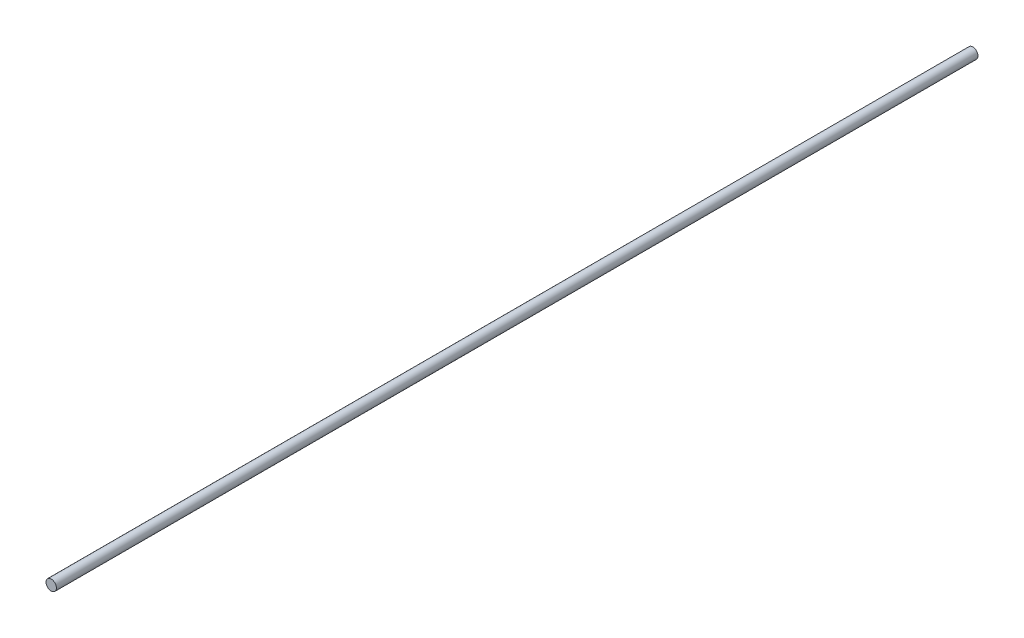
ISO-10303-21;
HEADER;
FILE_DESCRIPTION(('STEP AP214'),'2;1');
FILE_NAME('part.step','',(''),(''),'','','');
FILE_SCHEMA(('AUTOMOTIVE_DESIGN { 1 0 10303 214 1 1 1 1 }'));
ENDSEC;
DATA;
#1=APPLICATION_CONTEXT('core data for automotive mechanical design processes');
#2=APPLICATION_PROTOCOL_DEFINITION('international standard','automotive_design',2000,#1);
#3=PRODUCT_CONTEXT('',#1,'mechanical');
#4=PRODUCT('Part','Part','',(#3));
#5=PRODUCT_RELATED_PRODUCT_CATEGORY('part','',(#4));
#6=PRODUCT_DEFINITION_FORMATION('','',#4);
#7=PRODUCT_DEFINITION_CONTEXT('part definition',#1,'design');
#8=PRODUCT_DEFINITION('design','',#6,#7);
#9=PRODUCT_DEFINITION_SHAPE('','',#8);
#10=(LENGTH_UNIT() NAMED_UNIT(*) SI_UNIT(.MILLI.,.METRE.));
#11=(NAMED_UNIT(*) PLANE_ANGLE_UNIT() SI_UNIT($,.RADIAN.));
#12=(NAMED_UNIT(*) SI_UNIT($,.STERADIAN.) SOLID_ANGLE_UNIT());
#13=UNCERTAINTY_MEASURE_WITH_UNIT(LENGTH_MEASURE(1.E-05),#10,'distance_accuracy_value','');
#14=(GEOMETRIC_REPRESENTATION_CONTEXT(3) GLOBAL_UNCERTAINTY_ASSIGNED_CONTEXT((#13)) GLOBAL_UNIT_ASSIGNED_CONTEXT((#10,
#11,#12)) REPRESENTATION_CONTEXT('',''));
#15=CARTESIAN_POINT('',(0.,0.,0.));
#16=DIRECTION('',(0.,0.,1.));
#17=DIRECTION('',(1.,0.,0.));
#18=AXIS2_PLACEMENT_3D('',#15,#16,#17);
#19=CARTESIAN_POINT('',(0.,0.,-1122.1376259541));
#20=DIRECTION('',(0.,0.,1.));
#21=DIRECTION('',(1.,0.,0.));
#22=AXIS2_PLACEMENT_3D('',#19,#20,#21);
#23=CYLINDRICAL_SURFACE('',#22,6.35);
#24=CARTESIAN_POINT('',(0.,0.,-1122.1376259541));
#25=DIRECTION('',(0.,0.,1.));
#26=DIRECTION('',(1.,0.,0.));
#27=AXIS2_PLACEMENT_3D('',#24,#25,#26);
#28=CIRCLE('',#27,6.35);
#29=CARTESIAN_POINT('',(6.35,0.,-1122.1376259541));
#30=VERTEX_POINT('',#29);
#31=EDGE_CURVE('E10',#30,#30,#28,.T.);
#32=ORIENTED_EDGE('',*,*,#31,.T.);
#33=EDGE_LOOP('',(#32));
#34=FACE_BOUND('',#33,.T.);
#35=CARTESIAN_POINT('',(0.,0.,0.));
#36=DIRECTION('',(0.,0.,1.));
#37=DIRECTION('',(1.,0.,0.));
#38=AXIS2_PLACEMENT_3D('',#35,#36,#37);
#39=CIRCLE('',#38,6.35);
#40=CARTESIAN_POINT('',(6.35,0.,0.));
#41=VERTEX_POINT('',#40);
#42=EDGE_CURVE('E46',#41,#41,#39,.T.);
#43=ORIENTED_EDGE('',*,*,#42,.F.);
#44=EDGE_LOOP('',(#43));
#45=FACE_BOUND('',#44,.T.);
#46=ADVANCED_FACE('F43',(#34,#45),#23,.T.);
#47=CARTESIAN_POINT('',(0.,0.,-1122.1376259541));
#48=DIRECTION('',(0.,0.,1.));
#49=DIRECTION('',(1.,0.,0.));
#50=AXIS2_PLACEMENT_3D('',#47,#48,#49);
#51=PLANE('',#50);
#52=ORIENTED_EDGE('',*,*,#31,.F.);
#53=EDGE_LOOP('',(#52));
#54=FACE_BOUND('',#53,.T.);
#55=ADVANCED_FACE('F58',(#54),#51,.F.);
#56=CARTESIAN_POINT('',(0.,0.,0.));
#57=DIRECTION('',(0.,0.,1.));
#58=DIRECTION('',(1.,0.,0.));
#59=AXIS2_PLACEMENT_3D('',#56,#57,#58);
#60=PLANE('',#59);
#61=ORIENTED_EDGE('',*,*,#42,.T.);
#62=EDGE_LOOP('',(#61));
#63=FACE_BOUND('',#62,.T.);
#64=ADVANCED_FACE('F55',(#63),#60,.T.);
#65=CLOSED_SHELL('',(#46,#55,#64));
#66=MANIFOLD_SOLID_BREP('B2',#65);
#67=ADVANCED_BREP_SHAPE_REPRESENTATION('',(#18,#66),#14);
#68=SHAPE_DEFINITION_REPRESENTATION(#9,#67);
ENDSEC;
END-ISO-10303-21;
